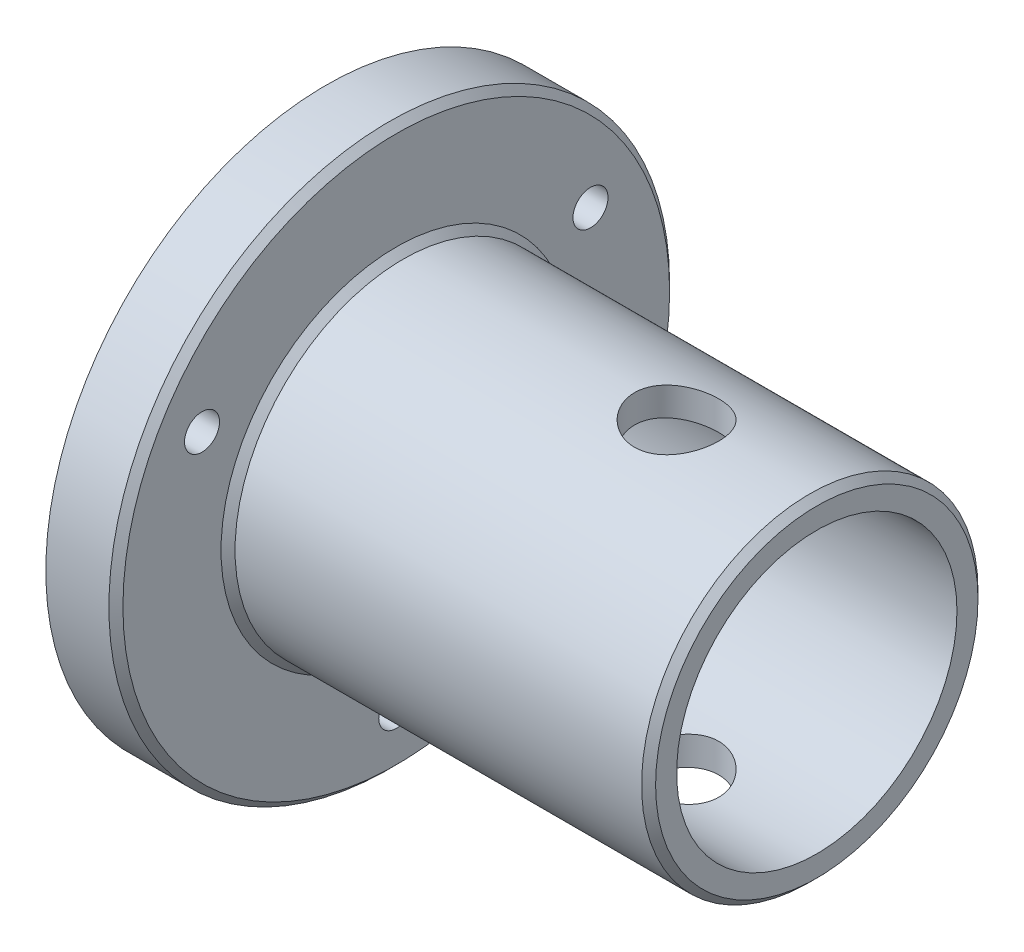
ISO-10303-21;
HEADER;
FILE_DESCRIPTION(('STEP AP214'),'2;1');
FILE_NAME('part.step','',(''),(''),'','','');
FILE_SCHEMA(('AUTOMOTIVE_DESIGN { 1 0 10303 214 1 1 1 1 }'));
ENDSEC;
DATA;
#1=APPLICATION_CONTEXT('core data for automotive mechanical design processes');
#2=APPLICATION_PROTOCOL_DEFINITION('international standard','automotive_design',2000,#1);
#3=PRODUCT_CONTEXT('',#1,'mechanical');
#4=PRODUCT('Part','Part','',(#3));
#5=PRODUCT_RELATED_PRODUCT_CATEGORY('part','',(#4));
#6=PRODUCT_DEFINITION_FORMATION('','',#4);
#7=PRODUCT_DEFINITION_CONTEXT('part definition',#1,'design');
#8=PRODUCT_DEFINITION('design','',#6,#7);
#9=PRODUCT_DEFINITION_SHAPE('','',#8);
#10=(LENGTH_UNIT() NAMED_UNIT(*) SI_UNIT(.MILLI.,.METRE.));
#11=(NAMED_UNIT(*) PLANE_ANGLE_UNIT() SI_UNIT($,.RADIAN.));
#12=(NAMED_UNIT(*) SI_UNIT($,.STERADIAN.) SOLID_ANGLE_UNIT());
#13=UNCERTAINTY_MEASURE_WITH_UNIT(LENGTH_MEASURE(1.E-05),#10,'distance_accuracy_value','');
#14=(GEOMETRIC_REPRESENTATION_CONTEXT(3) GLOBAL_UNCERTAINTY_ASSIGNED_CONTEXT((#13)) GLOBAL_UNIT_ASSIGNED_CONTEXT((#10,
#11,#12)) REPRESENTATION_CONTEXT('',''));
#15=CARTESIAN_POINT('',(0.,0.,0.));
#16=DIRECTION('',(0.,0.,1.));
#17=DIRECTION('',(1.,0.,0.));
#18=AXIS2_PLACEMENT_3D('',#15,#16,#17);
#19=CARTESIAN_POINT('',(35.,0.,0.));
#20=DIRECTION('',(-1.,0.,0.));
#21=DIRECTION('',(0.,0.,1.));
#22=AXIS2_PLACEMENT_3D('',#19,#20,#21);
#23=CYLINDRICAL_SURFACE('',#22,12.);
#24=CARTESIAN_POINT('',(5.50000000000001,0.,0.));
#25=DIRECTION('',(1.,0.,0.));
#26=DIRECTION('',(0.,0.,-1.));
#27=AXIS2_PLACEMENT_3D('',#24,#25,#26);
#28=CIRCLE('',#27,12.);
#29=CARTESIAN_POINT('',(5.50000000000001,0.,-12.));
#30=VERTEX_POINT('',#29);
#31=EDGE_CURVE('E51',#30,#30,#28,.T.);
#32=ORIENTED_EDGE('',*,*,#31,.T.);
#33=EDGE_LOOP('',(#32));
#34=FACE_BOUND('',#33,.T.);
#35=CARTESIAN_POINT('',(34.5,0.,0.));
#36=DIRECTION('',(1.,0.,0.));
#37=DIRECTION('',(0.,0.,-1.));
#38=AXIS2_PLACEMENT_3D('',#35,#36,#37);
#39=CIRCLE('',#38,12.);
#40=CARTESIAN_POINT('',(34.5,0.,-12.));
#41=VERTEX_POINT('',#40);
#42=EDGE_CURVE('E67',#41,#41,#39,.F.);
#43=ORIENTED_EDGE('',*,*,#42,.T.);
#44=EDGE_LOOP('',(#43));
#45=FACE_BOUND('',#44,.T.);
#46=CARTESIAN_POINT('',(25.,-11.6189500386223,-3.));
#47=CARTESIAN_POINT('',(25.1656609011119,-11.6189532010543,-2.99999529431169));
#48=CARTESIAN_POINT('',(25.3313738784142,-11.6225316721752,-2.98623149459718));
#49=CARTESIAN_POINT('',(25.6580410938082,-11.6364223439108,-2.93162775055655));
#50=CARTESIAN_POINT('',(25.8189925053618,-11.6467384634596,-2.89077204809053));
#51=CARTESIAN_POINT('',(26.1313642458246,-11.6728646951538,-2.78338943955845));
#52=CARTESIAN_POINT('',(26.2827965864629,-11.6886677122855,-2.71689567342539));
#53=CARTESIAN_POINT('',(26.5723730230479,-11.7239783043451,-2.56022536951366));
#54=CARTESIAN_POINT('',(26.7105165544963,-11.7434860365419,-2.47004782627282));
#55=CARTESIAN_POINT('',(26.9726339743147,-11.7844885962675,-2.26645011277426));
#56=CARTESIAN_POINT('',(27.0962723204201,-11.8060151714764,-2.15260426524486));
#57=CARTESIAN_POINT('',(27.3229136732324,-11.8483545061835,-1.9058184769208));
#58=CARTESIAN_POINT('',(27.4259147507461,-11.8691671987967,-1.77287675301637));
#59=CARTESIAN_POINT('',(27.6097305611575,-11.908084986247,-1.48937424129475));
#60=CARTESIAN_POINT('',(27.6902156657938,-11.9261482488071,-1.33859349143415));
#61=CARTESIAN_POINT('',(27.8245715729837,-11.9571697431118,-1.02511582115132));
#62=CARTESIAN_POINT('',(27.8784463022986,-11.9701287280121,-0.862420662950329));
#63=CARTESIAN_POINT('',(27.9569774014943,-11.9892571061782,-0.533230510504995));
#64=CARTESIAN_POINT('',(27.9822035731919,-11.9955587261318,-0.366879263458771));
#65=CARTESIAN_POINT('',(28.0045100551307,-12.0011231292876,-0.0321945831153245));
#66=CARTESIAN_POINT('',(28.0015945266515,-12.0003869531605,0.13613855344568));
#67=CARTESIAN_POINT('',(27.9681101796998,-11.9920571394424,0.466056741517159));
#68=CARTESIAN_POINT('',(27.9381564099354,-11.9846160280904,0.627708646803199));
#69=CARTESIAN_POINT('',(27.8524344759418,-11.9638900382983,0.943614742241057));
#70=CARTESIAN_POINT('',(27.7966649375471,-11.9506048487814,1.09786853811131));
#71=CARTESIAN_POINT('',(27.6603969151755,-11.9194501164106,1.39622011050542));
#72=CARTESIAN_POINT('',(27.5796795464059,-11.9015402363401,1.54021352929951));
#73=CARTESIAN_POINT('',(27.3959731850605,-11.8630788457163,1.81282686702147));
#74=CARTESIAN_POINT('',(27.2929803177273,-11.8425268758318,1.94144410525652));
#75=CARTESIAN_POINT('',(27.0643495096212,-11.8003645652323,2.18332210525486));
#76=CARTESIAN_POINT('',(26.9381741291827,-11.7787406343036,2.29607303722559));
#77=CARTESIAN_POINT('',(26.6684800317517,-11.7373805222079,2.49892912788906));
#78=CARTESIAN_POINT('',(26.5249605046107,-11.7176444292995,2.58903322813808));
#79=CARTESIAN_POINT('',(26.2236519590214,-11.6822459619518,2.74436438706776));
#80=CARTESIAN_POINT('',(26.0657971236246,-11.6666038046041,2.80946870091135));
#81=CARTESIAN_POINT('',(25.7408974383078,-11.641423681784,2.91205686190915));
#82=CARTESIAN_POINT('',(25.5738545632185,-11.6318844101128,2.94954661965919));
#83=CARTESIAN_POINT('',(25.2400485981641,-11.6202642720895,2.99499556639911));
#84=CARTESIAN_POINT('',(25.0733946479908,-11.6179930677232,3.00370856870295));
#85=CARTESIAN_POINT('',(24.7410136760977,-11.6206481203763,2.99342038861819));
#86=CARTESIAN_POINT('',(24.5752865704607,-11.6255737148436,2.97442175741977));
#87=CARTESIAN_POINT('',(24.2522628820617,-11.6418849838198,2.9099105567259));
#88=CARTESIAN_POINT('',(24.094872728117,-11.6531636429104,2.86483688193829));
#89=CARTESIAN_POINT('',(23.789882250576,-11.6808086191537,2.74994169800456));
#90=CARTESIAN_POINT('',(23.6422830891331,-11.6971755389569,2.680117257255));
#91=CARTESIAN_POINT('',(23.3578704665597,-11.7335536451461,2.51612480152392));
#92=CARTESIAN_POINT('',(23.2213253919484,-11.7536300232869,2.42150610460277));
#93=CARTESIAN_POINT('',(22.9657739646382,-11.7950049968534,2.21118087880336));
#94=CARTESIAN_POINT('',(22.8467705000199,-11.8163037927397,2.09547088441632));
#95=CARTESIAN_POINT('',(22.6266267489149,-11.8583688363813,1.84278816295419));
#96=CARTESIAN_POINT('',(22.5260079249414,-11.8791084247426,1.70535585759478));
#97=CARTESIAN_POINT('',(22.3492769596585,-11.9171665993643,1.41510804808403));
#98=CARTESIAN_POINT('',(22.2731635400702,-11.9344853640474,1.26229334687278));
#99=CARTESIAN_POINT('',(22.1482647585665,-11.9636413888599,0.946674605193275));
#100=CARTESIAN_POINT('',(22.0992828587451,-11.9755179602689,0.783952143083649));
#101=CARTESIAN_POINT('',(22.0294475984699,-11.9926235207495,0.452249280956423));
#102=CARTESIAN_POINT('',(22.0085888095132,-11.9978537927211,0.283270095123724));
#103=CARTESIAN_POINT('',(21.9958972312734,-12.0010250822642,-0.0512505793299667));
#104=CARTESIAN_POINT('',(22.0032948727138,-11.9991593663997,-0.216761480898062));
#105=CARTESIAN_POINT('',(22.045143481883,-11.9887768937233,-0.54410248924425));
#106=CARTESIAN_POINT('',(22.0795936450395,-11.9802603347151,-0.705932705342783));
#107=CARTESIAN_POINT('',(22.1741566593126,-11.9575629856167,-1.02051310693432));
#108=CARTESIAN_POINT('',(22.2341303599431,-11.9434129350718,-1.17330748374259));
#109=CARTESIAN_POINT('',(22.3779117370587,-11.9109386674097,-1.46675115912487));
#110=CARTESIAN_POINT('',(22.4617224180115,-11.8926139241627,-1.6073989237969));
#111=CARTESIAN_POINT('',(22.6531457019884,-11.8532174904086,-1.87620578526991));
#112=CARTESIAN_POINT('',(22.7612804287115,-11.8320905082499,-2.00398496489501));
#113=CARTESIAN_POINT('',(22.997268555932,-11.7897194717157,-2.23984506082051));
#114=CARTESIAN_POINT('',(23.1251269483335,-11.7684753890191,-2.34792097522977));
#115=CARTESIAN_POINT('',(23.3998042425684,-11.7278242753651,-2.54328607941549));
#116=CARTESIAN_POINT('',(23.5469323700958,-11.7084589101987,-2.63014985824914));
#117=CARTESIAN_POINT('',(23.8541664696245,-11.6743186648448,-2.77778068975641));
#118=CARTESIAN_POINT('',(24.0142628982815,-11.6595404469964,-2.83856672925646));
#119=CARTESIAN_POINT('',(24.3117310355055,-11.6385572625221,-2.92326758571301));
#120=CARTESIAN_POINT('',(24.4476794931584,-11.631259890105,-2.95197951179064));
#121=CARTESIAN_POINT('',(24.7224066069931,-11.6214551574786,-2.99034687771531));
#122=CARTESIAN_POINT('',(24.8611850207332,-11.6189473886732,-3.00000394311525));
#123=CARTESIAN_POINT('',(25.,-11.6189500386223,-3.));
#124=B_SPLINE_CURVE_WITH_KNOTS('',3,(#46,#47,#48,#49,#50,#51,#52,#53,#54,#55,#56,#57,#58,#59,
#60,#61,#62,#63,#64,#65,#66,#67,#68,#69,#70,#71,#72,#73,#74,#75,#76,#77,#78,#79,#80,#81,#82,#83,
#84,#85,#86,#87,#88,#89,#90,#91,#92,#93,#94,#95,#96,#97,#98,#99,#100,#101,#102,#103,#104,#105,
#106,#107,#108,#109,#110,#111,#112,#113,#114,#115,#116,#117,#118,#119,#120,#121,#122,#123),
.UNSPECIFIED.,.T.,.F.,(4,2,2,2,2,2,2,2,2,2,2,2,2,2,2,2,2,2,2,2,2,2,2,2,2,2,2,2,2,2,2,2,2,2,2,2,
2,2,4),(0.,0.496472930083361,0.993234889714398,1.48935687259923,1.98549992106574,
2.49148745031572,2.9975222577584,3.51061795677504,4.02363791816511,4.52626501194416,
5.02881778399225,5.52021915226736,6.01164668069743,6.50751449105333,7.00346862562696,
7.51284559886294,8.02224637439762,8.53411718410083,9.04587840155457,9.54412289717045,
10.042321526265,10.5323688601698,11.0224742571164,11.5221941503692,12.0219962266799,
12.5343039716432,13.046584988694,13.5551048737425,14.0635265869678,14.5582013535888,
15.0528614085831,15.5448585187759,16.0369176689162,16.5407651590442,17.0447403788455,
17.5581177274936,18.0711206565002,18.4871739262287,18.903191701295),.UNSPECIFIED.);
#125=CARTESIAN_POINT('',(25.,-11.6189500386223,-3.));
#126=VERTEX_POINT('',#125);
#127=EDGE_CURVE('E77',#126,#126,#124,.T.);
#128=ORIENTED_EDGE('',*,*,#127,.F.);
#129=EDGE_LOOP('',(#128));
#130=FACE_BOUND('',#129,.T.);
#131=CARTESIAN_POINT('',(25.,11.6189500386223,-3.));
#132=CARTESIAN_POINT('',(24.8343390988881,11.6189532010543,-2.99999529431169));
#133=CARTESIAN_POINT('',(24.6686261215858,11.6225316721752,-2.98623149459718));
#134=CARTESIAN_POINT('',(24.3419589061918,11.6364223439108,-2.93162775055655));
#135=CARTESIAN_POINT('',(24.1810074946382,11.6467384634596,-2.89077204809053));
#136=CARTESIAN_POINT('',(23.8686357541754,11.6728646951538,-2.78338943955845));
#137=CARTESIAN_POINT('',(23.7172034135372,11.6886677122855,-2.71689567342539));
#138=CARTESIAN_POINT('',(23.4276269769521,11.7239783043451,-2.56022536951366));
#139=CARTESIAN_POINT('',(23.2894834455037,11.7434860365419,-2.47004782627282));
#140=CARTESIAN_POINT('',(23.0273660256853,11.7844885962675,-2.26645011277426));
#141=CARTESIAN_POINT('',(22.9037276795799,11.8060151714764,-2.15260426524486));
#142=CARTESIAN_POINT('',(22.6770863267676,11.8483545061835,-1.9058184769208));
#143=CARTESIAN_POINT('',(22.5740852492539,11.8691671987967,-1.77287675301637));
#144=CARTESIAN_POINT('',(22.3902694388425,11.908084986247,-1.48937424129475));
#145=CARTESIAN_POINT('',(22.3097843342062,11.9261482488071,-1.33859349143415));
#146=CARTESIAN_POINT('',(22.1754284270163,11.9571697431118,-1.02511582115132));
#147=CARTESIAN_POINT('',(22.1215536977014,11.9701287280121,-0.862420662950329));
#148=CARTESIAN_POINT('',(22.0430225985057,11.9892571061782,-0.533230510504995));
#149=CARTESIAN_POINT('',(22.0177964268081,11.9955587261318,-0.366879263458771));
#150=CARTESIAN_POINT('',(21.9954899448693,12.0011231292876,-0.0321945831153245));
#151=CARTESIAN_POINT('',(21.9984054733485,12.0003869531605,0.13613855344568));
#152=CARTESIAN_POINT('',(22.0318898203002,11.9920571394424,0.466056741517159));
#153=CARTESIAN_POINT('',(22.0618435900646,11.9846160280904,0.627708646803199));
#154=CARTESIAN_POINT('',(22.1475655240582,11.9638900382983,0.943614742241057));
#155=CARTESIAN_POINT('',(22.2033350624529,11.9506048487814,1.09786853811131));
#156=CARTESIAN_POINT('',(22.3396030848245,11.9194501164106,1.39622011050542));
#157=CARTESIAN_POINT('',(22.4203204535941,11.9015402363401,1.54021352929951));
#158=CARTESIAN_POINT('',(22.6040268149395,11.8630788457163,1.81282686702147));
#159=CARTESIAN_POINT('',(22.7070196822728,11.8425268758318,1.94144410525652));
#160=CARTESIAN_POINT('',(22.9356504903788,11.8003645652323,2.18332210525486));
#161=CARTESIAN_POINT('',(23.0618258708173,11.7787406343036,2.29607303722559));
#162=CARTESIAN_POINT('',(23.3315199682483,11.7373805222079,2.49892912788906));
#163=CARTESIAN_POINT('',(23.4750394953893,11.7176444292995,2.58903322813808));
#164=CARTESIAN_POINT('',(23.7763480409786,11.6822459619518,2.74436438706776));
#165=CARTESIAN_POINT('',(23.9342028763754,11.6666038046041,2.80946870091135));
#166=CARTESIAN_POINT('',(24.2591025616922,11.641423681784,2.91205686190915));
#167=CARTESIAN_POINT('',(24.4261454367815,11.6318844101128,2.94954661965919));
#168=CARTESIAN_POINT('',(24.7599514018359,11.6202642720895,2.99499556639911));
#169=CARTESIAN_POINT('',(24.9266053520092,11.6179930677232,3.00370856870295));
#170=CARTESIAN_POINT('',(25.2589863239023,11.6206481203763,2.99342038861819));
#171=CARTESIAN_POINT('',(25.4247134295393,11.6255737148436,2.97442175741977));
#172=CARTESIAN_POINT('',(25.7477371179383,11.6418849838198,2.9099105567259));
#173=CARTESIAN_POINT('',(25.905127271883,11.6531636429104,2.86483688193829));
#174=CARTESIAN_POINT('',(26.210117749424,11.6808086191537,2.74994169800456));
#175=CARTESIAN_POINT('',(26.3577169108669,11.6971755389569,2.680117257255));
#176=CARTESIAN_POINT('',(26.6421295334403,11.7335536451461,2.51612480152392));
#177=CARTESIAN_POINT('',(26.7786746080516,11.7536300232869,2.42150610460277));
#178=CARTESIAN_POINT('',(27.0342260353618,11.7950049968534,2.21118087880336));
#179=CARTESIAN_POINT('',(27.1532294999801,11.8163037927397,2.09547088441632));
#180=CARTESIAN_POINT('',(27.3733732510851,11.8583688363813,1.84278816295419));
#181=CARTESIAN_POINT('',(27.4739920750586,11.8791084247426,1.70535585759478));
#182=CARTESIAN_POINT('',(27.6507230403415,11.9171665993643,1.41510804808403));
#183=CARTESIAN_POINT('',(27.7268364599299,11.9344853640474,1.26229334687278));
#184=CARTESIAN_POINT('',(27.8517352414335,11.9636413888599,0.946674605193275));
#185=CARTESIAN_POINT('',(27.9007171412549,11.9755179602689,0.783952143083649));
#186=CARTESIAN_POINT('',(27.9705524015301,11.9926235207495,0.452249280956423));
#187=CARTESIAN_POINT('',(27.9914111904869,11.9978537927211,0.283270095123724));
#188=CARTESIAN_POINT('',(28.0041027687266,12.0010250822642,-0.0512505793299667));
#189=CARTESIAN_POINT('',(27.9967051272862,11.9991593663997,-0.216761480898062));
#190=CARTESIAN_POINT('',(27.954856518117,11.9887768937233,-0.54410248924425));
#191=CARTESIAN_POINT('',(27.9204063549605,11.9802603347151,-0.705932705342783));
#192=CARTESIAN_POINT('',(27.8258433406874,11.9575629856167,-1.02051310693432));
#193=CARTESIAN_POINT('',(27.7658696400569,11.9434129350718,-1.17330748374259));
#194=CARTESIAN_POINT('',(27.6220882629413,11.9109386674097,-1.46675115912487));
#195=CARTESIAN_POINT('',(27.5382775819886,11.8926139241627,-1.6073989237969));
#196=CARTESIAN_POINT('',(27.3468542980116,11.8532174904086,-1.87620578526991));
#197=CARTESIAN_POINT('',(27.2387195712885,11.8320905082499,-2.00398496489501));
#198=CARTESIAN_POINT('',(27.002731444068,11.7897194717157,-2.23984506082051));
#199=CARTESIAN_POINT('',(26.8748730516665,11.7684753890191,-2.34792097522977));
#200=CARTESIAN_POINT('',(26.6001957574316,11.7278242753651,-2.54328607941549));
#201=CARTESIAN_POINT('',(26.4530676299042,11.7084589101987,-2.63014985824914));
#202=CARTESIAN_POINT('',(26.1458335303755,11.6743186648448,-2.77778068975641));
#203=CARTESIAN_POINT('',(25.9857371017185,11.6595404469964,-2.83856672925646));
#204=CARTESIAN_POINT('',(25.6882689644945,11.6385572625221,-2.92326758571301));
#205=CARTESIAN_POINT('',(25.5523205068416,11.631259890105,-2.95197951179064));
#206=CARTESIAN_POINT('',(25.2775933930069,11.6214551574786,-2.99034687771531));
#207=CARTESIAN_POINT('',(25.1388149792668,11.6189473886732,-3.00000394311525));
#208=CARTESIAN_POINT('',(25.,11.6189500386223,-3.));
#209=B_SPLINE_CURVE_WITH_KNOTS('',3,(#131,#132,#133,#134,#135,#136,#137,#138,#139,#140,#141,
#142,#143,#144,#145,#146,#147,#148,#149,#150,#151,#152,#153,#154,#155,#156,#157,#158,#159,#160,
#161,#162,#163,#164,#165,#166,#167,#168,#169,#170,#171,#172,#173,#174,#175,#176,#177,#178,#179,
#180,#181,#182,#183,#184,#185,#186,#187,#188,#189,#190,#191,#192,#193,#194,#195,#196,#197,#198,
#199,#200,#201,#202,#203,#204,#205,#206,#207,#208),.UNSPECIFIED.,.T.,.F.,(4,2,2,2,2,2,2,2,2,2,2,
2,2,2,2,2,2,2,2,2,2,2,2,2,2,2,2,2,2,2,2,2,2,2,2,2,2,2,4),(0.,0.496472930083361,
0.993234889714398,1.48935687259923,1.98549992106574,2.49148745031572,2.9975222577584,
3.51061795677504,4.02363791816511,4.52626501194416,5.02881778399225,5.52021915226736,
6.01164668069743,6.50751449105333,7.00346862562696,7.51284559886294,8.02224637439762,
8.53411718410083,9.04587840155457,9.54412289717045,10.042321526265,10.5323688601698,
11.0224742571164,11.5221941503692,12.0219962266799,12.5343039716432,13.046584988694,
13.5551048737425,14.0635265869678,14.5582013535888,15.0528614085831,15.5448585187759,
16.0369176689162,16.5407651590442,17.0447403788455,17.5581177274936,18.0711206565002,
18.4871739262287,18.903191701295),.UNSPECIFIED.);
#210=CARTESIAN_POINT('',(25.,11.6189500386223,-3.));
#211=VERTEX_POINT('',#210);
#212=EDGE_CURVE('E105',#211,#211,#209,.T.);
#213=ORIENTED_EDGE('',*,*,#212,.F.);
#214=EDGE_LOOP('',(#213));
#215=FACE_BOUND('',#214,.T.);
#216=ADVANCED_FACE('F42',(#34,#45,#130,#215),#23,.T.);
#217=CARTESIAN_POINT('',(5.,0.,0.));
#218=DIRECTION('',(1.,0.,0.));
#219=DIRECTION('',(0.,0.,-1.));
#220=AXIS2_PLACEMENT_3D('',#217,#218,#219);
#221=CYLINDRICAL_SURFACE('',#220,10.);
#222=CARTESIAN_POINT('',(5.,0.,0.));
#223=DIRECTION('',(1.,0.,0.));
#224=DIRECTION('',(0.,0.,-1.));
#225=AXIS2_PLACEMENT_3D('',#222,#223,#224);
#226=CIRCLE('',#225,10.);
#227=CARTESIAN_POINT('',(5.,0.,-10.));
#228=VERTEX_POINT('',#227);
#229=EDGE_CURVE('E199',#228,#228,#226,.T.);
#230=ORIENTED_EDGE('',*,*,#229,.F.);
#231=EDGE_LOOP('',(#230));
#232=FACE_BOUND('',#231,.T.);
#233=CARTESIAN_POINT('',(35.,0.,0.));
#234=DIRECTION('',(1.,0.,0.));
#235=DIRECTION('',(0.,0.,-1.));
#236=AXIS2_PLACEMENT_3D('',#233,#234,#235);
#237=CIRCLE('',#236,10.);
#238=CARTESIAN_POINT('',(35.,0.,-10.));
#239=VERTEX_POINT('',#238);
#240=EDGE_CURVE('E196',#239,#239,#237,.T.);
#241=ORIENTED_EDGE('',*,*,#240,.T.);
#242=EDGE_LOOP('',(#241));
#243=FACE_BOUND('',#242,.T.);
#244=CARTESIAN_POINT('',(25.,-9.53939201416946,-3.));
#245=CARTESIAN_POINT('',(24.8356109041152,-9.5393937145396,-2.99999795267528));
#246=CARTESIAN_POINT('',(24.671201551712,-9.54368780418137,-2.98644216334284));
#247=CARTESIAN_POINT('',(24.3471895008161,-9.56033156605799,-2.93271688893498));
#248=CARTESIAN_POINT('',(24.1875884269971,-9.57268392986936,-2.89253851147156));
#249=CARTESIAN_POINT('',(23.8779305434565,-9.60392204971265,-2.78705506539911));
#250=CARTESIAN_POINT('',(23.7278583407338,-9.62279693406465,-2.72179178788487));
#251=CARTESIAN_POINT('',(23.4407561320094,-9.66493865095134,-2.56812843835858));
#252=CARTESIAN_POINT('',(23.3037280826311,-9.68820614082039,-2.47972490274105));
#253=CARTESIAN_POINT('',(23.0422672188453,-9.73733724371531,-2.27929508283254));
#254=CARTESIAN_POINT('',(22.9183082041074,-9.76325616623271,-2.16666414351613));
#255=CARTESIAN_POINT('',(22.690724097355,-9.81429723873514,-1.9222724751592));
#256=CARTESIAN_POINT('',(22.5871016191002,-9.8394192859541,-1.79050929092222));
#257=CARTESIAN_POINT('',(22.4010746003334,-9.88666429158777,-1.50822287558738));
#258=CARTESIAN_POINT('',(22.3191531511144,-9.90871448684808,-1.35736804267163));
#259=CARTESIAN_POINT('',(22.1820254819145,-9.94668871841369,-1.04324929073871));
#260=CARTESIAN_POINT('',(22.1268135002851,-9.96261407578992,-0.879988056775822));
#261=CARTESIAN_POINT('',(22.046239997819,-9.98615292007178,-0.550647705261659));
#262=CARTESIAN_POINT('',(22.0200697446946,-9.99399114738673,-0.384782797907603));
#263=CARTESIAN_POINT('',(21.9957653507071,-10.001264030027,-0.0508436474986273));
#264=CARTESIAN_POINT('',(21.9976253211961,-10.0007004504217,0.117230124100744));
#265=CARTESIAN_POINT('',(22.028785737086,-9.99139207635305,0.445142313200315));
#266=CARTESIAN_POINT('',(22.0572103876197,-9.98290840410475,0.605072535282661));
#267=CARTESIAN_POINT('',(22.1392626719886,-9.95903044225231,0.917778426885077));
#268=CARTESIAN_POINT('',(22.1928919018855,-9.9436357150134,1.07055364264578));
#269=CARTESIAN_POINT('',(22.324424046837,-9.90730441973756,1.36669465270248));
#270=CARTESIAN_POINT('',(22.4026024056139,-9.88630539352772,1.50993012938864));
#271=CARTESIAN_POINT('',(22.580795704857,-9.84099281296778,1.78152934756663));
#272=CARTESIAN_POINT('',(22.6808158259292,-9.81667847277943,1.90988954974545));
#273=CARTESIAN_POINT('',(22.9043955015009,-9.76623100973852,2.15332096305837));
#274=CARTESIAN_POINT('',(23.0287138380508,-9.74006390633503,2.26768916079756));
#275=CARTESIAN_POINT('',(23.2950200357888,-9.68967959784414,2.47415303080115));
#276=CARTESIAN_POINT('',(23.437009650811,-9.66546258669242,2.56624648967452));
#277=CARTESIAN_POINT('',(23.7364789384722,-9.62155806359712,2.72627990669512));
#278=CARTESIAN_POINT('',(23.8940940916175,-9.6019162125849,2.79397978469378));
#279=CARTESIAN_POINT('',(24.2192144167786,-9.5699278496379,2.9016672575074));
#280=CARTESIAN_POINT('',(24.3867163430351,-9.55757895796639,2.94166389279495));
#281=CARTESIAN_POINT('',(24.7201647215024,-9.54209699116239,2.99149540565762));
#282=CARTESIAN_POINT('',(24.8859364477944,-9.53863757349917,3.00239892760807));
#283=CARTESIAN_POINT('',(25.2169458000133,-9.54042384874812,2.99671894465741));
#284=CARTESIAN_POINT('',(25.38218349746,-9.54566832310787,2.98013928742559));
#285=CARTESIAN_POINT('',(25.7029767559434,-9.56395117112153,2.92091527148479));
#286=CARTESIAN_POINT('',(25.8586723285275,-9.57678353015602,2.87895922862587));
#287=CARTESIAN_POINT('',(26.1608033816294,-9.6085828246183,2.77097155495853));
#288=CARTESIAN_POINT('',(26.307237428281,-9.62755070717977,2.70493620685512));
#289=CARTESIAN_POINT('',(26.5910349281444,-9.67011670046268,2.54863742393008));
#290=CARTESIAN_POINT('',(26.7280494419716,-9.69382542139644,2.4577712834546));
#291=CARTESIAN_POINT('',(26.9852762123616,-9.74296411293928,2.25510603200767));
#292=CARTESIAN_POINT('',(27.1054844352256,-9.76839449459994,2.14330191069792));
#293=CARTESIAN_POINT('',(27.3303608116295,-9.81927267096329,1.8969102649872));
#294=CARTESIAN_POINT('',(27.434271257974,-9.84468490126011,1.76162213171487));
#295=CARTESIAN_POINT('',(27.6179334020555,-9.89169703497298,1.4749235691805));
#296=CARTESIAN_POINT('',(27.6976862995629,-9.91329712769433,1.32351394108789));
#297=CARTESIAN_POINT('',(27.8300000611366,-9.95011940949915,1.00987100941044));
#298=CARTESIAN_POINT('',(27.882764032318,-9.96538906849932,0.847729244075677));
#299=CARTESIAN_POINT('',(27.9601218377808,-9.98803959193653,0.516339933009175));
#300=CARTESIAN_POINT('',(27.9847237318968,-9.9954227134176,0.347094434709524));
#301=CARTESIAN_POINT('',(28.004446088109,-10.001330881628,0.0133043077654842));
#302=CARTESIAN_POINT('',(28.0006653908157,-10.0001861022264,-0.151170358172415));
#303=CARTESIAN_POINT('',(27.9663567350018,-9.98994528930073,-0.477038962328809));
#304=CARTESIAN_POINT('',(27.9358302930391,-9.98084970660925,-0.638433074693059));
#305=CARTESIAN_POINT('',(27.8495766772008,-9.95582336716653,-0.951871626082718));
#306=CARTESIAN_POINT('',(27.794123638702,-9.93996705801731,-1.10399785470279));
#307=CARTESIAN_POINT('',(27.6598361709856,-9.903058860789,-1.39686647550411));
#308=CARTESIAN_POINT('',(27.5809978994276,-9.88200611899892,-1.53760699210116));
#309=CARTESIAN_POINT('',(27.3992530851399,-9.83607931656457,-1.80860378484113));
#310=CARTESIAN_POINT('',(27.2956571399985,-9.81110453847118,-1.93838050015353));
#311=CARTESIAN_POINT('',(27.0685792233344,-9.76047074424668,-2.17907514269189));
#312=CARTESIAN_POINT('',(26.9450915242037,-9.73481153282158,-2.28998761920387));
#313=CARTESIAN_POINT('',(26.677318443379,-9.68481361262638,-2.49312538789097));
#314=CARTESIAN_POINT('',(26.5325228932191,-9.66053705386971,-2.58469519515913));
#315=CARTESIAN_POINT('',(26.228889651678,-9.61705095017586,-2.74208627057551));
#316=CARTESIAN_POINT('',(26.0700587527976,-9.59783897193911,-2.80791991114577));
#317=CARTESIAN_POINT('',(25.7605191367875,-9.56855633435189,-2.90603885065899));
#318=CARTESIAN_POINT('',(25.610782706138,-9.5577230968104,-2.94117718022463));
#319=CARTESIAN_POINT('',(25.3073695550085,-9.54314085194333,-2.98815637670288));
#320=CARTESIAN_POINT('',(25.1536936307095,-9.53939042442861,-3.00000191412191));
#321=CARTESIAN_POINT('',(25.,-9.53939201416946,-3.));
#322=B_SPLINE_CURVE_WITH_KNOTS('',3,(#244,#245,#246,#247,#248,#249,#250,#251,#252,#253,#254,
#255,#256,#257,#258,#259,#260,#261,#262,#263,#264,#265,#266,#267,#268,#269,#270,#271,#272,#273,
#274,#275,#276,#277,#278,#279,#280,#281,#282,#283,#284,#285,#286,#287,#288,#289,#290,#291,#292,
#293,#294,#295,#296,#297,#298,#299,#300,#301,#302,#303,#304,#305,#306,#307,#308,#309,#310,#311,
#312,#313,#314,#315,#316,#317,#318,#319,#320,#321),.UNSPECIFIED.,.T.,.F.,(4,2,2,2,2,2,2,2,2,2,2,
2,2,2,2,2,2,2,2,2,2,2,2,2,2,2,2,2,2,2,2,2,2,2,2,2,2,2,4),(0.,0.492600331831084,
0.985365283378001,1.47731282893239,1.9693340507402,2.47546300015968,2.98165695742546,
3.49831878547289,4.01486911175754,4.51664280299115,5.01831108202881,5.50400251981761,
5.98972471780753,6.48110418671353,6.97260033181661,7.48304294046556,7.99353624983726,
8.50892476494935,9.02414501262033,9.52016161585829,10.0161087821999,10.4991718988284,
10.9823096209678,11.4784146362399,11.9746385186306,12.4895901220641,13.0045161465361,
13.5155078363386,14.0263532464857,14.5175260782765,15.0086710610072,15.4945419374965,
15.9804926898797,16.4819925411419,16.9836370526499,17.500232793435,18.016579879331,
18.4772230772011,18.9377739007233),.UNSPECIFIED.);
#323=CARTESIAN_POINT('',(25.,-9.53939201416946,-3.));
#324=VERTEX_POINT('',#323);
#325=EDGE_CURVE('E78',#324,#324,#322,.T.);
#326=ORIENTED_EDGE('',*,*,#325,.F.);
#327=EDGE_LOOP('',(#326));
#328=FACE_BOUND('',#327,.T.);
#329=CARTESIAN_POINT('',(25.,9.53939201416946,-3.));
#330=CARTESIAN_POINT('',(25.1643890958848,9.5393937145396,-2.99999795267528));
#331=CARTESIAN_POINT('',(25.328798448288,9.54368780418137,-2.98644216334284));
#332=CARTESIAN_POINT('',(25.6528104991839,9.56033156605799,-2.93271688893498));
#333=CARTESIAN_POINT('',(25.8124115730029,9.57268392986936,-2.89253851147156));
#334=CARTESIAN_POINT('',(26.1220694565435,9.60392204971265,-2.78705506539911));
#335=CARTESIAN_POINT('',(26.2721416592662,9.62279693406465,-2.72179178788487));
#336=CARTESIAN_POINT('',(26.5592438679906,9.66493865095134,-2.56812843835858));
#337=CARTESIAN_POINT('',(26.6962719173689,9.68820614082039,-2.47972490274105));
#338=CARTESIAN_POINT('',(26.9577327811548,9.73733724371531,-2.27929508283254));
#339=CARTESIAN_POINT('',(27.0816917958926,9.76325616623271,-2.16666414351613));
#340=CARTESIAN_POINT('',(27.309275902645,9.81429723873514,-1.9222724751592));
#341=CARTESIAN_POINT('',(27.4128983808998,9.8394192859541,-1.79050929092222));
#342=CARTESIAN_POINT('',(27.5989253996666,9.88666429158777,-1.50822287558738));
#343=CARTESIAN_POINT('',(27.6808468488856,9.90871448684808,-1.35736804267163));
#344=CARTESIAN_POINT('',(27.8179745180855,9.94668871841369,-1.04324929073871));
#345=CARTESIAN_POINT('',(27.8731864997149,9.96261407578992,-0.879988056775822));
#346=CARTESIAN_POINT('',(27.953760002181,9.98615292007178,-0.550647705261659));
#347=CARTESIAN_POINT('',(27.9799302553054,9.99399114738673,-0.384782797907603));
#348=CARTESIAN_POINT('',(28.0042346492929,10.001264030027,-0.0508436474986273));
#349=CARTESIAN_POINT('',(28.0023746788039,10.0007004504217,0.117230124100744));
#350=CARTESIAN_POINT('',(27.971214262914,9.99139207635305,0.445142313200315));
#351=CARTESIAN_POINT('',(27.9427896123803,9.98290840410475,0.605072535282661));
#352=CARTESIAN_POINT('',(27.8607373280114,9.95903044225231,0.917778426885077));
#353=CARTESIAN_POINT('',(27.8071080981145,9.9436357150134,1.07055364264578));
#354=CARTESIAN_POINT('',(27.675575953163,9.90730441973756,1.36669465270248));
#355=CARTESIAN_POINT('',(27.5973975943861,9.88630539352772,1.50993012938864));
#356=CARTESIAN_POINT('',(27.419204295143,9.84099281296778,1.78152934756663));
#357=CARTESIAN_POINT('',(27.3191841740708,9.81667847277943,1.90988954974545));
#358=CARTESIAN_POINT('',(27.0956044984991,9.76623100973852,2.15332096305837));
#359=CARTESIAN_POINT('',(26.9712861619492,9.74006390633503,2.26768916079756));
#360=CARTESIAN_POINT('',(26.7049799642112,9.68967959784414,2.47415303080115));
#361=CARTESIAN_POINT('',(26.562990349189,9.66546258669242,2.56624648967452));
#362=CARTESIAN_POINT('',(26.2635210615278,9.62155806359712,2.72627990669512));
#363=CARTESIAN_POINT('',(26.1059059083825,9.6019162125849,2.79397978469378));
#364=CARTESIAN_POINT('',(25.7807855832214,9.5699278496379,2.9016672575074));
#365=CARTESIAN_POINT('',(25.6132836569649,9.55757895796639,2.94166389279495));
#366=CARTESIAN_POINT('',(25.2798352784976,9.54209699116239,2.99149540565762));
#367=CARTESIAN_POINT('',(25.1140635522056,9.53863757349917,3.00239892760807));
#368=CARTESIAN_POINT('',(24.7830541999867,9.54042384874812,2.99671894465741));
#369=CARTESIAN_POINT('',(24.61781650254,9.54566832310787,2.98013928742559));
#370=CARTESIAN_POINT('',(24.2970232440566,9.56395117112153,2.92091527148479));
#371=CARTESIAN_POINT('',(24.1413276714725,9.57678353015602,2.87895922862587));
#372=CARTESIAN_POINT('',(23.8391966183706,9.6085828246183,2.77097155495853));
#373=CARTESIAN_POINT('',(23.692762571719,9.62755070717977,2.70493620685512));
#374=CARTESIAN_POINT('',(23.4089650718556,9.67011670046268,2.54863742393008));
#375=CARTESIAN_POINT('',(23.2719505580284,9.69382542139644,2.4577712834546));
#376=CARTESIAN_POINT('',(23.0147237876384,9.74296411293928,2.25510603200767));
#377=CARTESIAN_POINT('',(22.8945155647744,9.76839449459994,2.14330191069792));
#378=CARTESIAN_POINT('',(22.6696391883705,9.81927267096329,1.8969102649872));
#379=CARTESIAN_POINT('',(22.565728742026,9.84468490126011,1.76162213171487));
#380=CARTESIAN_POINT('',(22.3820665979445,9.89169703497298,1.4749235691805));
#381=CARTESIAN_POINT('',(22.3023137004371,9.91329712769433,1.32351394108789));
#382=CARTESIAN_POINT('',(22.1699999388634,9.95011940949915,1.00987100941044));
#383=CARTESIAN_POINT('',(22.117235967682,9.96538906849932,0.847729244075677));
#384=CARTESIAN_POINT('',(22.0398781622192,9.98803959193653,0.516339933009175));
#385=CARTESIAN_POINT('',(22.0152762681032,9.9954227134176,0.347094434709524));
#386=CARTESIAN_POINT('',(21.995553911891,10.001330881628,0.0133043077654842));
#387=CARTESIAN_POINT('',(21.9993346091843,10.0001861022264,-0.151170358172415));
#388=CARTESIAN_POINT('',(22.0336432649982,9.98994528930073,-0.477038962328809));
#389=CARTESIAN_POINT('',(22.0641697069609,9.98084970660925,-0.638433074693059));
#390=CARTESIAN_POINT('',(22.1504233227992,9.95582336716653,-0.951871626082718));
#391=CARTESIAN_POINT('',(22.205876361298,9.93996705801731,-1.10399785470279));
#392=CARTESIAN_POINT('',(22.3401638290144,9.903058860789,-1.39686647550411));
#393=CARTESIAN_POINT('',(22.4190021005724,9.88200611899892,-1.53760699210116));
#394=CARTESIAN_POINT('',(22.6007469148601,9.83607931656457,-1.80860378484113));
#395=CARTESIAN_POINT('',(22.7043428600015,9.81110453847119,-1.93838050015354));
#396=CARTESIAN_POINT('',(22.9314207766656,9.76047074424668,-2.17907514269189));
#397=CARTESIAN_POINT('',(23.0549084757963,9.73481153282158,-2.28998761920387));
#398=CARTESIAN_POINT('',(23.322681556621,9.68481361262638,-2.49312538789097));
#399=CARTESIAN_POINT('',(23.4674771067809,9.66053705386971,-2.58469519515913));
#400=CARTESIAN_POINT('',(23.771110348322,9.61705095017586,-2.74208627057551));
#401=CARTESIAN_POINT('',(23.9299412472024,9.59783897193911,-2.80791991114577));
#402=CARTESIAN_POINT('',(24.2394808632125,9.56855633435189,-2.90603885065899));
#403=CARTESIAN_POINT('',(24.389217293862,9.5577230968104,-2.94117718022463));
#404=CARTESIAN_POINT('',(24.6926304449915,9.54314085194333,-2.98815637670288));
#405=CARTESIAN_POINT('',(24.8463063692905,9.53939042442861,-3.00000191412191));
#406=CARTESIAN_POINT('',(25.,9.53939201416946,-3.));
#407=B_SPLINE_CURVE_WITH_KNOTS('',3,(#329,#330,#331,#332,#333,#334,#335,#336,#337,#338,#339,
#340,#341,#342,#343,#344,#345,#346,#347,#348,#349,#350,#351,#352,#353,#354,#355,#356,#357,#358,
#359,#360,#361,#362,#363,#364,#365,#366,#367,#368,#369,#370,#371,#372,#373,#374,#375,#376,#377,
#378,#379,#380,#381,#382,#383,#384,#385,#386,#387,#388,#389,#390,#391,#392,#393,#394,#395,#396,
#397,#398,#399,#400,#401,#402,#403,#404,#405,#406),.UNSPECIFIED.,.T.,.F.,(4,2,2,2,2,2,2,2,2,2,2,
2,2,2,2,2,2,2,2,2,2,2,2,2,2,2,2,2,2,2,2,2,2,2,2,2,2,2,4),(0.,0.492600331831084,
0.985365283378001,1.47731282893239,1.9693340507402,2.47546300015968,2.98165695742546,
3.49831878547289,4.01486911175754,4.51664280299115,5.01831108202881,5.50400251981761,
5.98972471780753,6.48110418671353,6.97260033181661,7.48304294046556,7.99353624983726,
8.50892476494935,9.02414501262033,9.52016161585829,10.0161087821999,10.4991718988284,
10.9823096209678,11.4784146362399,11.9746385186306,12.4895901220641,13.0045161465361,
13.5155078363386,14.0263532464857,14.5175260782765,15.0086710610072,15.4945419374965,
15.9804926898797,16.4819925411419,16.9836370526499,17.500232793435,18.016579879331,
18.4772230772011,18.9377739007233),.UNSPECIFIED.);
#408=CARTESIAN_POINT('',(25.,9.53939201416946,-3.));
#409=VERTEX_POINT('',#408);
#410=EDGE_CURVE('E68',#409,#409,#407,.T.);
#411=ORIENTED_EDGE('',*,*,#410,.F.);
#412=EDGE_LOOP('',(#411));
#413=FACE_BOUND('',#412,.T.);
#414=ADVANCED_FACE('F83',(#232,#243,#328,#413),#221,.F.);
#415=CARTESIAN_POINT('',(5.,0.,0.));
#416=DIRECTION('',(-1.,0.,0.));
#417=DIRECTION('',(0.,0.,1.));
#418=AXIS2_PLACEMENT_3D('',#415,#416,#417);
#419=CYLINDRICAL_SURFACE('',#418,20.);
#420=CARTESIAN_POINT('',(4.5,0.,0.));
#421=DIRECTION('',(1.,0.,0.));
#422=DIRECTION('',(0.,0.,-1.));
#423=AXIS2_PLACEMENT_3D('',#420,#421,#422);
#424=CIRCLE('',#423,20.);
#425=CARTESIAN_POINT('',(4.5,0.,-20.));
#426=VERTEX_POINT('',#425);
#427=EDGE_CURVE('E56',#426,#426,#424,.F.);
#428=ORIENTED_EDGE('',*,*,#427,.T.);
#429=EDGE_LOOP('',(#428));
#430=FACE_BOUND('',#429,.T.);
#431=CARTESIAN_POINT('',(0.,0.,0.));
#432=DIRECTION('',(1.,0.,0.));
#433=DIRECTION('',(0.,0.,-1.));
#434=AXIS2_PLACEMENT_3D('',#431,#432,#433);
#435=CIRCLE('',#434,20.);
#436=CARTESIAN_POINT('',(0.,0.,-20.));
#437=VERTEX_POINT('',#436);
#438=EDGE_CURVE('E170',#437,#437,#435,.T.);
#439=ORIENTED_EDGE('',*,*,#438,.T.);
#440=EDGE_LOOP('',(#439));
#441=FACE_BOUND('',#440,.T.);
#442=ADVANCED_FACE('F131',(#430,#441),#419,.T.);
#443=CARTESIAN_POINT('',(5.,0.,0.));
#444=DIRECTION('',(1.,0.,0.));
#445=DIRECTION('',(0.,0.,-1.));
#446=AXIS2_PLACEMENT_3D('',#443,#444,#445);
#447=PLANE('',#446);
#448=CARTESIAN_POINT('',(5.,0.,0.));
#449=DIRECTION('',(1.,0.,0.));
#450=DIRECTION('',(0.,0.,-1.));
#451=AXIS2_PLACEMENT_3D('',#448,#449,#450);
#452=CIRCLE('',#451,12.5);
#453=CARTESIAN_POINT('',(5.,0.,-12.5));
#454=VERTEX_POINT('',#453);
#455=EDGE_CURVE('E10',#454,#454,#452,.F.);
#456=ORIENTED_EDGE('',*,*,#455,.T.);
#457=EDGE_LOOP('',(#456));
#458=FACE_BOUND('',#457,.T.);
#459=CARTESIAN_POINT('',(5.,0.,0.));
#460=DIRECTION('',(1.,0.,0.));
#461=DIRECTION('',(0.,0.,-1.));
#462=AXIS2_PLACEMENT_3D('',#459,#460,#461);
#463=CIRCLE('',#462,19.5);
#464=CARTESIAN_POINT('',(5.,0.,-19.5));
#465=VERTEX_POINT('',#464);
#466=EDGE_CURVE('E61',#465,#465,#463,.T.);
#467=ORIENTED_EDGE('',*,*,#466,.T.);
#468=EDGE_LOOP('',(#467));
#469=FACE_BOUND('',#468,.T.);
#470=CARTESIAN_POINT('',(5.,8.,-13.856406460551));
#471=DIRECTION('',(1.,0.,0.));
#472=DIRECTION('',(0.,0.,-1.));
#473=AXIS2_PLACEMENT_3D('',#470,#471,#472);
#474=CIRCLE('',#473,1.24999999999999);
#475=CARTESIAN_POINT('',(5.,8.,-15.106406460551));
#476=VERTEX_POINT('',#475);
#477=EDGE_CURVE('E161',#476,#476,#474,.T.);
#478=ORIENTED_EDGE('',*,*,#477,.F.);
#479=EDGE_LOOP('',(#478));
#480=FACE_BOUND('',#479,.T.);
#481=CARTESIAN_POINT('',(5.,8.,13.856406460551));
#482=DIRECTION('',(1.,0.,0.));
#483=DIRECTION('',(0.,0.,-1.));
#484=AXIS2_PLACEMENT_3D('',#481,#482,#483);
#485=CIRCLE('',#484,1.24999999999999);
#486=CARTESIAN_POINT('',(5.,8.,12.606406460551));
#487=VERTEX_POINT('',#486);
#488=EDGE_CURVE('E165',#487,#487,#485,.T.);
#489=ORIENTED_EDGE('',*,*,#488,.F.);
#490=EDGE_LOOP('',(#489));
#491=FACE_BOUND('',#490,.T.);
#492=CARTESIAN_POINT('',(5.,-16.,0.));
#493=DIRECTION('',(1.,0.,0.));
#494=DIRECTION('',(0.,0.,-1.));
#495=AXIS2_PLACEMENT_3D('',#492,#493,#494);
#496=CIRCLE('',#495,1.24999999999999);
#497=CARTESIAN_POINT('',(5.,-16.,-1.24999999999999));
#498=VERTEX_POINT('',#497);
#499=EDGE_CURVE('E168',#498,#498,#496,.T.);
#500=ORIENTED_EDGE('',*,*,#499,.F.);
#501=EDGE_LOOP('',(#500));
#502=FACE_BOUND('',#501,.T.);
#503=ADVANCED_FACE('F128',(#458,#469,#480,#491,#502),#447,.T.);
#504=CARTESIAN_POINT('',(0.,0.,0.));
#505=DIRECTION('',(1.,0.,0.));
#506=DIRECTION('',(0.,0.,-1.));
#507=AXIS2_PLACEMENT_3D('',#504,#505,#506);
#508=PLANE('',#507);
#509=CARTESIAN_POINT('',(0.,8.,-13.856406460551));
#510=DIRECTION('',(-1.,0.,0.));
#511=DIRECTION('',(0.,0.,1.));
#512=AXIS2_PLACEMENT_3D('',#509,#510,#511);
#513=CIRCLE('',#512,1.24999999999999);
#514=CARTESIAN_POINT('',(0.,8.,-12.606406460551));
#515=VERTEX_POINT('',#514);
#516=EDGE_CURVE('E204',#515,#515,#513,.T.);
#517=ORIENTED_EDGE('',*,*,#516,.F.);
#518=EDGE_LOOP('',(#517));
#519=FACE_BOUND('',#518,.T.);
#520=CARTESIAN_POINT('',(0.,8.,13.856406460551));
#521=DIRECTION('',(-1.,0.,0.));
#522=DIRECTION('',(0.,0.,1.));
#523=AXIS2_PLACEMENT_3D('',#520,#521,#522);
#524=CIRCLE('',#523,1.24999999999999);
#525=CARTESIAN_POINT('',(0.,8.,15.106406460551));
#526=VERTEX_POINT('',#525);
#527=EDGE_CURVE('E212',#526,#526,#524,.T.);
#528=ORIENTED_EDGE('',*,*,#527,.F.);
#529=EDGE_LOOP('',(#528));
#530=FACE_BOUND('',#529,.T.);
#531=CARTESIAN_POINT('',(0.,-16.,0.));
#532=DIRECTION('',(-1.,0.,0.));
#533=DIRECTION('',(0.,0.,1.));
#534=AXIS2_PLACEMENT_3D('',#531,#532,#533);
#535=CIRCLE('',#534,1.24999999999999);
#536=CARTESIAN_POINT('',(0.,-16.,1.24999999999999));
#537=VERTEX_POINT('',#536);
#538=EDGE_CURVE('E171',#537,#537,#535,.T.);
#539=ORIENTED_EDGE('',*,*,#538,.F.);
#540=EDGE_LOOP('',(#539));
#541=FACE_BOUND('',#540,.T.);
#542=ORIENTED_EDGE('',*,*,#438,.F.);
#543=EDGE_LOOP('',(#542));
#544=FACE_BOUND('',#543,.T.);
#545=ADVANCED_FACE('F126',(#519,#530,#541,#544),#508,.F.);
#546=CARTESIAN_POINT('',(0.,-16.,0.));
#547=DIRECTION('',(-1.,0.,0.));
#548=DIRECTION('',(0.,0.,1.));
#549=AXIS2_PLACEMENT_3D('',#546,#547,#548);
#550=CYLINDRICAL_SURFACE('',#549,1.24999999999999);
#551=ORIENTED_EDGE('',*,*,#499,.T.);
#552=EDGE_LOOP('',(#551));
#553=FACE_BOUND('',#552,.T.);
#554=ORIENTED_EDGE('',*,*,#538,.T.);
#555=EDGE_LOOP('',(#554));
#556=FACE_BOUND('',#555,.T.);
#557=ADVANCED_FACE('F122',(#553,#556),#550,.F.);
#558=CARTESIAN_POINT('',(0.,8.,13.856406460551));
#559=DIRECTION('',(-1.,0.,0.));
#560=DIRECTION('',(0.,0.,1.));
#561=AXIS2_PLACEMENT_3D('',#558,#559,#560);
#562=CYLINDRICAL_SURFACE('',#561,1.24999999999999);
#563=ORIENTED_EDGE('',*,*,#488,.T.);
#564=EDGE_LOOP('',(#563));
#565=FACE_BOUND('',#564,.T.);
#566=ORIENTED_EDGE('',*,*,#527,.T.);
#567=EDGE_LOOP('',(#566));
#568=FACE_BOUND('',#567,.T.);
#569=ADVANCED_FACE('F118',(#565,#568),#562,.F.);
#570=CARTESIAN_POINT('',(0.,8.,-13.856406460551));
#571=DIRECTION('',(-1.,0.,0.));
#572=DIRECTION('',(0.,0.,1.));
#573=AXIS2_PLACEMENT_3D('',#570,#571,#572);
#574=CYLINDRICAL_SURFACE('',#573,1.24999999999999);
#575=ORIENTED_EDGE('',*,*,#477,.T.);
#576=EDGE_LOOP('',(#575));
#577=FACE_BOUND('',#576,.T.);
#578=ORIENTED_EDGE('',*,*,#516,.T.);
#579=EDGE_LOOP('',(#578));
#580=FACE_BOUND('',#579,.T.);
#581=ADVANCED_FACE('F114',(#577,#580),#574,.F.);
#582=CARTESIAN_POINT('',(35.,0.,0.));
#583=DIRECTION('',(1.,0.,0.));
#584=DIRECTION('',(0.,0.,-1.));
#585=AXIS2_PLACEMENT_3D('',#582,#583,#584);
#586=PLANE('',#585);
#587=CARTESIAN_POINT('',(35.,0.,0.));
#588=DIRECTION('',(1.,0.,0.));
#589=DIRECTION('',(0.,0.,-1.));
#590=AXIS2_PLACEMENT_3D('',#587,#588,#589);
#591=CIRCLE('',#590,11.5);
#592=CARTESIAN_POINT('',(35.,0.,-11.5));
#593=VERTEX_POINT('',#592);
#594=EDGE_CURVE('E176',#593,#593,#591,.T.);
#595=ORIENTED_EDGE('',*,*,#594,.T.);
#596=EDGE_LOOP('',(#595));
#597=FACE_BOUND('',#596,.T.);
#598=ORIENTED_EDGE('',*,*,#240,.F.);
#599=EDGE_LOOP('',(#598));
#600=FACE_BOUND('',#599,.T.);
#601=ADVANCED_FACE('F113',(#597,#600),#586,.T.);
#602=CARTESIAN_POINT('',(5.,0.,0.));
#603=DIRECTION('',(1.,0.,0.));
#604=DIRECTION('',(0.,0.,-1.));
#605=AXIS2_PLACEMENT_3D('',#602,#603,#604);
#606=PLANE('',#605);
#607=ORIENTED_EDGE('',*,*,#229,.T.);
#608=EDGE_LOOP('',(#607));
#609=FACE_BOUND('',#608,.T.);
#610=ADVANCED_FACE('F93',(#609),#606,.T.);
#611=CARTESIAN_POINT('',(35.,0.,0.));
#612=DIRECTION('',(-1.,0.,0.));
#613=DIRECTION('',(0.,0.,1.));
#614=AXIS2_PLACEMENT_3D('',#611,#612,#613);
#615=CONICAL_SURFACE('',#614,11.5,0.78539816339744);
#616=ORIENTED_EDGE('',*,*,#42,.F.);
#617=EDGE_LOOP('',(#616));
#618=FACE_BOUND('',#617,.T.);
#619=ORIENTED_EDGE('',*,*,#594,.F.);
#620=EDGE_LOOP('',(#619));
#621=FACE_BOUND('',#620,.T.);
#622=ADVANCED_FACE('F139',(#618,#621),#615,.T.);
#623=CARTESIAN_POINT('',(25.,20.,0.));
#624=DIRECTION('',(0.,-1.,0.));
#625=DIRECTION('',(0.,0.,-1.));
#626=AXIS2_PLACEMENT_3D('',#623,#624,#625);
#627=CYLINDRICAL_SURFACE('',#626,3.);
#628=ORIENTED_EDGE('',*,*,#325,.T.);
#629=EDGE_LOOP('',(#628));
#630=FACE_BOUND('',#629,.T.);
#631=ORIENTED_EDGE('',*,*,#127,.T.);
#632=EDGE_LOOP('',(#631));
#633=FACE_BOUND('',#632,.T.);
#634=ADVANCED_FACE('F91',(#630,#633),#627,.F.);
#635=ORIENTED_EDGE('',*,*,#410,.T.);
#636=EDGE_LOOP('',(#635));
#637=FACE_BOUND('',#636,.T.);
#638=ORIENTED_EDGE('',*,*,#212,.T.);
#639=EDGE_LOOP('',(#638));
#640=FACE_BOUND('',#639,.T.);
#641=ADVANCED_FACE('F87',(#637,#640),#627,.F.);
#642=CARTESIAN_POINT('',(5.,0.,0.));
#643=DIRECTION('',(-1.,0.,0.));
#644=DIRECTION('',(0.,0.,1.));
#645=AXIS2_PLACEMENT_3D('',#642,#643,#644);
#646=CONICAL_SURFACE('',#645,19.5,0.785398163397441);
#647=ORIENTED_EDGE('',*,*,#427,.F.);
#648=EDGE_LOOP('',(#647));
#649=FACE_BOUND('',#648,.T.);
#650=ORIENTED_EDGE('',*,*,#466,.F.);
#651=EDGE_LOOP('',(#650));
#652=FACE_BOUND('',#651,.T.);
#653=ADVANCED_FACE('F90',(#649,#652),#646,.T.);
#654=CARTESIAN_POINT('',(5.50000000000001,0.,0.));
#655=DIRECTION('',(-1.,0.,0.));
#656=DIRECTION('',(0.,0.,1.));
#657=AXIS2_PLACEMENT_3D('',#654,#655,#656);
#658=CONICAL_SURFACE('',#657,12.,0.785398163397447);
#659=ORIENTED_EDGE('',*,*,#455,.F.);
#660=EDGE_LOOP('',(#659));
#661=FACE_BOUND('',#660,.T.);
#662=ORIENTED_EDGE('',*,*,#31,.F.);
#663=EDGE_LOOP('',(#662));
#664=FACE_BOUND('',#663,.T.);
#665=ADVANCED_FACE('F45',(#661,#664),#658,.T.);
#666=CLOSED_SHELL('',(#216,#414,#442,#503,#545,#557,#569,#581,#601,#610,#622,#634,#641,#653,#665));
#667=MANIFOLD_SOLID_BREP('B2',#666);
#668=ADVANCED_BREP_SHAPE_REPRESENTATION('',(#18,#667),#14);
#669=SHAPE_DEFINITION_REPRESENTATION(#9,#668);
ENDSEC;
END-ISO-10303-21;
